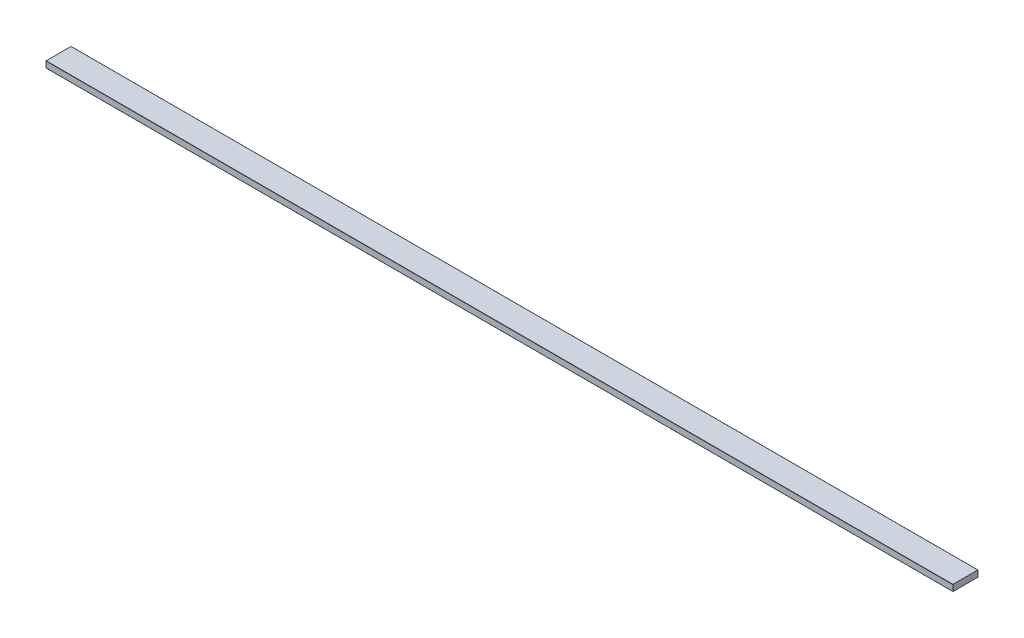
ISO-10303-21;
HEADER;
FILE_DESCRIPTION(('STEP AP214'),'2;1');
FILE_NAME('part.step','',(''),(''),'','','');
FILE_SCHEMA(('AUTOMOTIVE_DESIGN { 1 0 10303 214 1 1 1 1 }'));
ENDSEC;
DATA;
#1=APPLICATION_CONTEXT('core data for automotive mechanical design processes');
#2=APPLICATION_PROTOCOL_DEFINITION('international standard','automotive_design',2000,#1);
#3=PRODUCT_CONTEXT('',#1,'mechanical');
#4=PRODUCT('Part','Part','',(#3));
#5=PRODUCT_RELATED_PRODUCT_CATEGORY('part','',(#4));
#6=PRODUCT_DEFINITION_FORMATION('','',#4);
#7=PRODUCT_DEFINITION_CONTEXT('part definition',#1,'design');
#8=PRODUCT_DEFINITION('design','',#6,#7);
#9=PRODUCT_DEFINITION_SHAPE('','',#8);
#10=(LENGTH_UNIT() NAMED_UNIT(*) SI_UNIT(.MILLI.,.METRE.));
#11=(NAMED_UNIT(*) PLANE_ANGLE_UNIT() SI_UNIT($,.RADIAN.));
#12=(NAMED_UNIT(*) SI_UNIT($,.STERADIAN.) SOLID_ANGLE_UNIT());
#13=UNCERTAINTY_MEASURE_WITH_UNIT(LENGTH_MEASURE(1.E-05),#10,'distance_accuracy_value','');
#14=(GEOMETRIC_REPRESENTATION_CONTEXT(3) GLOBAL_UNCERTAINTY_ASSIGNED_CONTEXT((#13)) GLOBAL_UNIT_ASSIGNED_CONTEXT((#10,
#11,#12)) REPRESENTATION_CONTEXT('',''));
#15=CARTESIAN_POINT('',(0.,0.,0.));
#16=DIRECTION('',(0.,0.,1.));
#17=DIRECTION('',(1.,0.,0.));
#18=AXIS2_PLACEMENT_3D('',#15,#16,#17);
#19=CARTESIAN_POINT('',(-457.2,-3.17500000000001,-12.6999999999999));
#20=DIRECTION('',(-1.,0.,0.));
#21=DIRECTION('',(0.,0.,1.));
#22=AXIS2_PLACEMENT_3D('',#19,#20,#21);
#23=PLANE('',#22);
#24=DIRECTION('',(0.,0.,1.));
#25=VECTOR('',#24,1.);
#26=CARTESIAN_POINT('',(-457.2,-3.17500000000001,-12.6999999999999));
#27=LINE('',#26,#25);
#28=CARTESIAN_POINT('',(-457.2,-3.17500000000001,-12.4904499999999));
#29=VERTEX_POINT('',#28);
#30=CARTESIAN_POINT('',(-457.2,-3.17500000000001,12.4904499999999));
#31=VERTEX_POINT('',#30);
#32=EDGE_CURVE('E191',#29,#31,#27,.T.);
#33=ORIENTED_EDGE('',*,*,#32,.T.);
#34=CARTESIAN_POINT('',(-457.2,-2.96545000000001,12.4904499999999));
#35=DIRECTION('',(-1.,0.,0.));
#36=DIRECTION('',(0.,0.,1.));
#37=AXIS2_PLACEMENT_3D('',#34,#35,#36);
#38=CIRCLE('',#37,0.20955);
#39=CARTESIAN_POINT('',(-457.2,-2.96545000000001,12.6999999999999));
#40=VERTEX_POINT('',#39);
#41=EDGE_CURVE('E169',#31,#40,#38,.T.);
#42=ORIENTED_EDGE('',*,*,#41,.T.);
#43=DIRECTION('',(0.,1.,0.));
#44=VECTOR('',#43,1.);
#45=CARTESIAN_POINT('',(-457.2,-3.17500000000001,12.6999999999999));
#46=LINE('',#45,#44);
#47=CARTESIAN_POINT('',(-457.2,2.96544999999999,12.6999999999999));
#48=VERTEX_POINT('',#47);
#49=EDGE_CURVE('E130',#40,#48,#46,.T.);
#50=ORIENTED_EDGE('',*,*,#49,.T.);
#51=CARTESIAN_POINT('',(-457.2,2.96544999999999,12.4904499999999));
#52=DIRECTION('',(-1.,0.,0.));
#53=DIRECTION('',(0.,0.,1.));
#54=AXIS2_PLACEMENT_3D('',#51,#52,#53);
#55=CIRCLE('',#54,0.20955);
#56=CARTESIAN_POINT('',(-457.2,3.17499999999999,12.4904499999999));
#57=VERTEX_POINT('',#56);
#58=EDGE_CURVE('E162',#48,#57,#55,.T.);
#59=ORIENTED_EDGE('',*,*,#58,.T.);
#60=DIRECTION('',(0.,0.,1.));
#61=VECTOR('',#60,1.);
#62=CARTESIAN_POINT('',(-457.2,3.17499999999999,-12.6999999999999));
#63=LINE('',#62,#61);
#64=CARTESIAN_POINT('',(-457.2,3.17499999999999,-12.4904499999999));
#65=VERTEX_POINT('',#64);
#66=EDGE_CURVE('E186',#65,#57,#63,.T.);
#67=ORIENTED_EDGE('',*,*,#66,.F.);
#68=CARTESIAN_POINT('',(-457.2,2.96544999999999,-12.4904499999999));
#69=DIRECTION('',(-1.,0.,0.));
#70=DIRECTION('',(0.,0.,1.));
#71=AXIS2_PLACEMENT_3D('',#68,#69,#70);
#72=CIRCLE('',#71,0.20955);
#73=CARTESIAN_POINT('',(-457.2,2.96544999999999,-12.6999999999999));
#74=VERTEX_POINT('',#73);
#75=EDGE_CURVE('E57',#65,#74,#72,.T.);
#76=ORIENTED_EDGE('',*,*,#75,.T.);
#77=DIRECTION('',(0.,1.,0.));
#78=VECTOR('',#77,1.);
#79=CARTESIAN_POINT('',(-457.2,-3.17500000000001,-12.6999999999999));
#80=LINE('',#79,#78);
#81=CARTESIAN_POINT('',(-457.2,-2.96545000000001,-12.6999999999999));
#82=VERTEX_POINT('',#81);
#83=EDGE_CURVE('E143',#82,#74,#80,.T.);
#84=ORIENTED_EDGE('',*,*,#83,.F.);
#85=CARTESIAN_POINT('',(-457.2,-2.96545000000001,-12.4904499999999));
#86=DIRECTION('',(-1.,0.,0.));
#87=DIRECTION('',(0.,0.,1.));
#88=AXIS2_PLACEMENT_3D('',#85,#86,#87);
#89=CIRCLE('',#88,0.20955);
#90=EDGE_CURVE('E65',#82,#29,#89,.T.);
#91=ORIENTED_EDGE('',*,*,#90,.T.);
#92=EDGE_LOOP('',(#33,#42,#50,#59,#67,#76,#84,#91));
#93=FACE_BOUND('',#92,.T.);
#94=ADVANCED_FACE('F41',(#93),#23,.T.);
#95=CARTESIAN_POINT('',(-457.2,-3.17500000000001,-12.6999999999999));
#96=DIRECTION('',(0.,0.,-1.));
#97=DIRECTION('',(-1.,0.,0.));
#98=AXIS2_PLACEMENT_3D('',#95,#96,#97);
#99=PLANE('',#98);
#100=DIRECTION('',(0.,1.,0.));
#101=VECTOR('',#100,1.);
#102=CARTESIAN_POINT('',(457.2,-3.17500000000001,-12.6999999999999));
#103=LINE('',#102,#101);
#104=CARTESIAN_POINT('',(457.2,-2.96545000000001,-12.6999999999999));
#105=VERTEX_POINT('',#104);
#106=CARTESIAN_POINT('',(457.2,2.96544999999999,-12.6999999999999));
#107=VERTEX_POINT('',#106);
#108=EDGE_CURVE('E138',#105,#107,#103,.T.);
#109=ORIENTED_EDGE('',*,*,#108,.F.);
#110=DIRECTION('',(-1.,0.,0.));
#111=VECTOR('',#110,1.);
#112=CARTESIAN_POINT('',(-457.2,-2.96545000000001,-12.6999999999999));
#113=LINE('',#112,#111);
#114=EDGE_CURVE('E175',#105,#82,#113,.T.);
#115=ORIENTED_EDGE('',*,*,#114,.T.);
#116=ORIENTED_EDGE('',*,*,#83,.T.);
#117=DIRECTION('',(-1.,0.,0.));
#118=VECTOR('',#117,1.);
#119=CARTESIAN_POINT('',(-457.2,2.96544999999999,-12.6999999999999));
#120=LINE('',#119,#118);
#121=EDGE_CURVE('E172',#74,#107,#120,.F.);
#122=ORIENTED_EDGE('',*,*,#121,.T.);
#123=EDGE_LOOP('',(#109,#115,#116,#122));
#124=FACE_BOUND('',#123,.T.);
#125=ADVANCED_FACE('F204',(#124),#99,.T.);
#126=CARTESIAN_POINT('',(457.2,-3.17500000000001,-12.6999999999999));
#127=DIRECTION('',(1.,0.,0.));
#128=DIRECTION('',(0.,0.,-1.));
#129=AXIS2_PLACEMENT_3D('',#126,#127,#128);
#130=PLANE('',#129);
#131=DIRECTION('',(0.,1.,0.));
#132=VECTOR('',#131,1.);
#133=CARTESIAN_POINT('',(457.2,-3.17500000000001,12.6999999999999));
#134=LINE('',#133,#132);
#135=CARTESIAN_POINT('',(457.2,-2.96545000000001,12.6999999999999));
#136=VERTEX_POINT('',#135);
#137=CARTESIAN_POINT('',(457.2,2.96544999999999,12.6999999999999));
#138=VERTEX_POINT('',#137);
#139=EDGE_CURVE('E127',#136,#138,#134,.T.);
#140=ORIENTED_EDGE('',*,*,#139,.F.);
#141=CARTESIAN_POINT('',(457.2,-2.96545000000001,12.4904499999999));
#142=DIRECTION('',(1.,0.,0.));
#143=DIRECTION('',(0.,0.,-1.));
#144=AXIS2_PLACEMENT_3D('',#141,#142,#143);
#145=CIRCLE('',#144,0.20955);
#146=CARTESIAN_POINT('',(457.2,-3.17500000000001,12.4904499999999));
#147=VERTEX_POINT('',#146);
#148=EDGE_CURVE('E109',#136,#147,#145,.T.);
#149=ORIENTED_EDGE('',*,*,#148,.T.);
#150=DIRECTION('',(0.,0.,-1.));
#151=VECTOR('',#150,1.);
#152=CARTESIAN_POINT('',(457.2,-3.17500000000001,-12.6999999999999));
#153=LINE('',#152,#151);
#154=CARTESIAN_POINT('',(457.2,-3.17500000000001,-12.4904499999999));
#155=VERTEX_POINT('',#154);
#156=EDGE_CURVE('E145',#147,#155,#153,.T.);
#157=ORIENTED_EDGE('',*,*,#156,.T.);
#158=CARTESIAN_POINT('',(457.2,-2.96545000000001,-12.4904499999999));
#159=DIRECTION('',(1.,0.,0.));
#160=DIRECTION('',(0.,0.,-1.));
#161=AXIS2_PLACEMENT_3D('',#158,#159,#160);
#162=CIRCLE('',#161,0.20955);
#163=EDGE_CURVE('E121',#155,#105,#162,.T.);
#164=ORIENTED_EDGE('',*,*,#163,.T.);
#165=ORIENTED_EDGE('',*,*,#108,.T.);
#166=CARTESIAN_POINT('',(457.2,2.96544999999999,-12.4904499999999));
#167=DIRECTION('',(1.,0.,0.));
#168=DIRECTION('',(0.,0.,-1.));
#169=AXIS2_PLACEMENT_3D('',#166,#167,#168);
#170=CIRCLE('',#169,0.20955);
#171=CARTESIAN_POINT('',(457.2,3.17499999999999,-12.4904499999999));
#172=VERTEX_POINT('',#171);
#173=EDGE_CURVE('E153',#107,#172,#170,.T.);
#174=ORIENTED_EDGE('',*,*,#173,.T.);
#175=DIRECTION('',(0.,0.,-1.));
#176=VECTOR('',#175,1.);
#177=CARTESIAN_POINT('',(457.2,3.17499999999999,-12.6999999999999));
#178=LINE('',#177,#176);
#179=CARTESIAN_POINT('',(457.2,3.17499999999999,12.4904499999999));
#180=VERTEX_POINT('',#179);
#181=EDGE_CURVE('E184',#180,#172,#178,.T.);
#182=ORIENTED_EDGE('',*,*,#181,.F.);
#183=CARTESIAN_POINT('',(457.2,2.96544999999999,12.4904499999999));
#184=DIRECTION('',(1.,0.,0.));
#185=DIRECTION('',(0.,0.,-1.));
#186=AXIS2_PLACEMENT_3D('',#183,#184,#185);
#187=CIRCLE('',#186,0.20955);
#188=EDGE_CURVE('E132',#180,#138,#187,.T.);
#189=ORIENTED_EDGE('',*,*,#188,.T.);
#190=EDGE_LOOP('',(#140,#149,#157,#164,#165,#174,#182,#189));
#191=FACE_BOUND('',#190,.T.);
#192=ADVANCED_FACE('F135',(#191),#130,.T.);
#193=CARTESIAN_POINT('',(-457.2,-3.17500000000001,12.6999999999999));
#194=DIRECTION('',(0.,0.,1.));
#195=DIRECTION('',(1.,0.,0.));
#196=AXIS2_PLACEMENT_3D('',#193,#194,#195);
#197=PLANE('',#196);
#198=ORIENTED_EDGE('',*,*,#49,.F.);
#199=DIRECTION('',(1.,0.,0.));
#200=VECTOR('',#199,1.);
#201=CARTESIAN_POINT('',(457.2,-2.96545000000001,12.6999999999999));
#202=LINE('',#201,#200);
#203=EDGE_CURVE('E113',#40,#136,#202,.T.);
#204=ORIENTED_EDGE('',*,*,#203,.T.);
#205=ORIENTED_EDGE('',*,*,#139,.T.);
#206=DIRECTION('',(1.,0.,0.));
#207=VECTOR('',#206,1.);
#208=CARTESIAN_POINT('',(-457.2,2.96544999999999,12.6999999999999));
#209=LINE('',#208,#207);
#210=EDGE_CURVE('E133',#138,#48,#209,.F.);
#211=ORIENTED_EDGE('',*,*,#210,.T.);
#212=EDGE_LOOP('',(#198,#204,#205,#211));
#213=FACE_BOUND('',#212,.T.);
#214=ADVANCED_FACE('F126',(#213),#197,.T.);
#215=CARTESIAN_POINT('',(0.,-3.17500000000001,0.));
#216=DIRECTION('',(0.,1.,0.));
#217=DIRECTION('',(0.,0.,1.));
#218=AXIS2_PLACEMENT_3D('',#215,#216,#217);
#219=PLANE('',#218);
#220=ORIENTED_EDGE('',*,*,#156,.F.);
#221=DIRECTION('',(1.,0.,0.));
#222=VECTOR('',#221,1.);
#223=CARTESIAN_POINT('',(-457.2,-3.17500000000001,12.4904499999999));
#224=LINE('',#223,#222);
#225=EDGE_CURVE('E114',#147,#31,#224,.F.);
#226=ORIENTED_EDGE('',*,*,#225,.T.);
#227=ORIENTED_EDGE('',*,*,#32,.F.);
#228=DIRECTION('',(-1.,0.,0.));
#229=VECTOR('',#228,1.);
#230=CARTESIAN_POINT('',(457.2,-3.17500000000001,-12.4904499999999));
#231=LINE('',#230,#229);
#232=EDGE_CURVE('E120',#29,#155,#231,.F.);
#233=ORIENTED_EDGE('',*,*,#232,.T.);
#234=EDGE_LOOP('',(#220,#226,#227,#233));
#235=FACE_BOUND('',#234,.T.);
#236=ADVANCED_FACE('F228',(#235),#219,.F.);
#237=CARTESIAN_POINT('',(0.,3.17499999999999,0.));
#238=DIRECTION('',(0.,1.,0.));
#239=DIRECTION('',(0.,0.,1.));
#240=AXIS2_PLACEMENT_3D('',#237,#238,#239);
#241=PLANE('',#240);
#242=ORIENTED_EDGE('',*,*,#181,.T.);
#243=DIRECTION('',(-1.,0.,0.));
#244=VECTOR('',#243,1.);
#245=CARTESIAN_POINT('',(0.,3.17499999999999,-12.4904499999999));
#246=LINE('',#245,#244);
#247=EDGE_CURVE('E11',#172,#65,#246,.T.);
#248=ORIENTED_EDGE('',*,*,#247,.T.);
#249=ORIENTED_EDGE('',*,*,#66,.T.);
#250=DIRECTION('',(1.,0.,0.));
#251=VECTOR('',#250,1.);
#252=CARTESIAN_POINT('',(0.,3.17499999999999,12.4904499999999));
#253=LINE('',#252,#251);
#254=EDGE_CURVE('E50',#57,#180,#253,.T.);
#255=ORIENTED_EDGE('',*,*,#254,.T.);
#256=EDGE_LOOP('',(#242,#248,#249,#255));
#257=FACE_BOUND('',#256,.T.);
#258=ADVANCED_FACE('F183',(#257),#241,.T.);
#259=CARTESIAN_POINT('',(-457.2,-2.96545000000001,12.4904499999999));
#260=DIRECTION('',(-1.,0.,0.));
#261=DIRECTION('',(0.,0.,1.));
#262=AXIS2_PLACEMENT_3D('',#259,#260,#261);
#263=CYLINDRICAL_SURFACE('',#262,0.20955);
#264=ORIENTED_EDGE('',*,*,#41,.F.);
#265=ORIENTED_EDGE('',*,*,#225,.F.);
#266=ORIENTED_EDGE('',*,*,#148,.F.);
#267=ORIENTED_EDGE('',*,*,#203,.F.);
#268=EDGE_LOOP('',(#264,#265,#266,#267));
#269=FACE_BOUND('',#268,.T.);
#270=ADVANCED_FACE('F112',(#269),#263,.T.);
#271=CARTESIAN_POINT('',(-457.2,-2.96545000000001,-12.4904499999999));
#272=DIRECTION('',(1.,0.,0.));
#273=DIRECTION('',(0.,0.,-1.));
#274=AXIS2_PLACEMENT_3D('',#271,#272,#273);
#275=CYLINDRICAL_SURFACE('',#274,0.20955);
#276=ORIENTED_EDGE('',*,*,#163,.F.);
#277=ORIENTED_EDGE('',*,*,#232,.F.);
#278=ORIENTED_EDGE('',*,*,#90,.F.);
#279=ORIENTED_EDGE('',*,*,#114,.F.);
#280=EDGE_LOOP('',(#276,#277,#278,#279));
#281=FACE_BOUND('',#280,.T.);
#282=ADVANCED_FACE('F211',(#281),#275,.T.);
#283=CARTESIAN_POINT('',(0.,2.96544999999999,-12.4904499999999));
#284=DIRECTION('',(-1.,0.,0.));
#285=DIRECTION('',(0.,0.,1.));
#286=AXIS2_PLACEMENT_3D('',#283,#284,#285);
#287=CYLINDRICAL_SURFACE('',#286,0.20955);
#288=ORIENTED_EDGE('',*,*,#173,.F.);
#289=ORIENTED_EDGE('',*,*,#121,.F.);
#290=ORIENTED_EDGE('',*,*,#75,.F.);
#291=ORIENTED_EDGE('',*,*,#247,.F.);
#292=EDGE_LOOP('',(#288,#289,#290,#291));
#293=FACE_BOUND('',#292,.T.);
#294=ADVANCED_FACE('F206',(#293),#287,.T.);
#295=CARTESIAN_POINT('',(0.,2.96544999999999,12.4904499999999));
#296=DIRECTION('',(1.,0.,0.));
#297=DIRECTION('',(0.,0.,-1.));
#298=AXIS2_PLACEMENT_3D('',#295,#296,#297);
#299=CYLINDRICAL_SURFACE('',#298,0.20955);
#300=ORIENTED_EDGE('',*,*,#58,.F.);
#301=ORIENTED_EDGE('',*,*,#210,.F.);
#302=ORIENTED_EDGE('',*,*,#188,.F.);
#303=ORIENTED_EDGE('',*,*,#254,.F.);
#304=EDGE_LOOP('',(#300,#301,#302,#303));
#305=FACE_BOUND('',#304,.T.);
#306=ADVANCED_FACE('F43',(#305),#299,.T.);
#307=CLOSED_SHELL('',(#94,#125,#192,#214,#236,#258,#270,#282,#294,#306));
#308=MANIFOLD_SOLID_BREP('B2',#307);
#309=ADVANCED_BREP_SHAPE_REPRESENTATION('',(#18,#308),#14);
#310=SHAPE_DEFINITION_REPRESENTATION(#9,#309);
ENDSEC;
END-ISO-10303-21;
